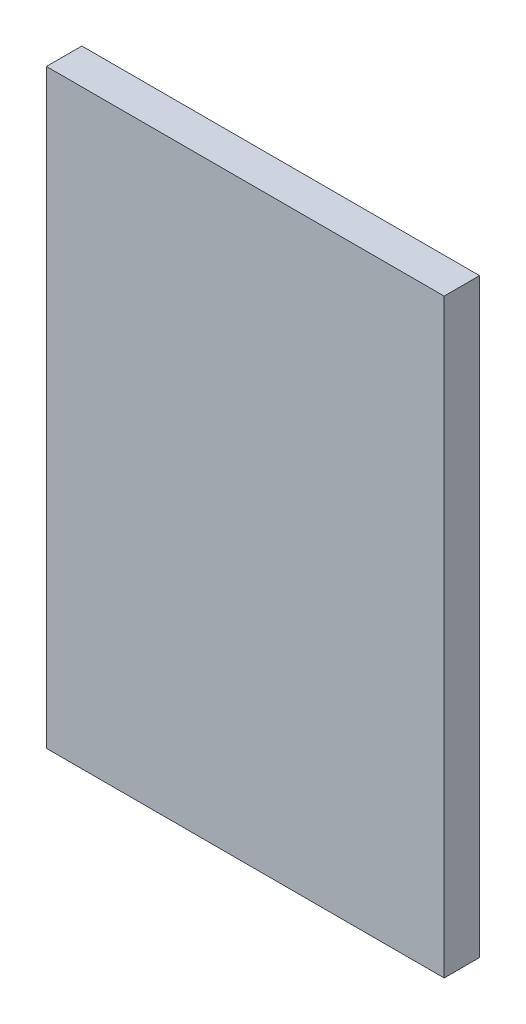
ISO-10303-21;
HEADER;
FILE_DESCRIPTION(('STEP AP214'),'2;1');
FILE_NAME('part.step','',(''),(''),'','','');
FILE_SCHEMA(('AUTOMOTIVE_DESIGN { 1 0 10303 214 1 1 1 1 }'));
ENDSEC;
DATA;
#1=APPLICATION_CONTEXT('core data for automotive mechanical design processes');
#2=APPLICATION_PROTOCOL_DEFINITION('international standard','automotive_design',2000,#1);
#3=PRODUCT_CONTEXT('',#1,'mechanical');
#4=PRODUCT('Part','Part','',(#3));
#5=PRODUCT_RELATED_PRODUCT_CATEGORY('part','',(#4));
#6=PRODUCT_DEFINITION_FORMATION('','',#4);
#7=PRODUCT_DEFINITION_CONTEXT('part definition',#1,'design');
#8=PRODUCT_DEFINITION('design','',#6,#7);
#9=PRODUCT_DEFINITION_SHAPE('','',#8);
#10=(LENGTH_UNIT() NAMED_UNIT(*) SI_UNIT(.MILLI.,.METRE.));
#11=(NAMED_UNIT(*) PLANE_ANGLE_UNIT() SI_UNIT($,.RADIAN.));
#12=(NAMED_UNIT(*) SI_UNIT($,.STERADIAN.) SOLID_ANGLE_UNIT());
#13=UNCERTAINTY_MEASURE_WITH_UNIT(LENGTH_MEASURE(1.E-05),#10,'distance_accuracy_value','');
#14=(GEOMETRIC_REPRESENTATION_CONTEXT(3) GLOBAL_UNCERTAINTY_ASSIGNED_CONTEXT((#13)) GLOBAL_UNIT_ASSIGNED_CONTEXT((#10,
#11,#12)) REPRESENTATION_CONTEXT('',''));
#15=CARTESIAN_POINT('',(0.,0.,0.));
#16=DIRECTION('',(0.,0.,1.));
#17=DIRECTION('',(1.,0.,0.));
#18=AXIS2_PLACEMENT_3D('',#15,#16,#17);
#19=CARTESIAN_POINT('',(99.8219999999999,148.209,17.78));
#20=DIRECTION('',(-1.,0.,0.));
#21=DIRECTION('',(0.,-1.,0.));
#22=AXIS2_PLACEMENT_3D('',#19,#20,#21);
#23=PLANE('',#22);
#24=DIRECTION('',(0.,1.,0.));
#25=VECTOR('',#24,1.);
#26=CARTESIAN_POINT('',(99.8219999999999,148.209,0.));
#27=LINE('',#26,#25);
#28=CARTESIAN_POINT('',(99.822,-148.209,0.));
#29=VERTEX_POINT('',#28);
#30=CARTESIAN_POINT('',(99.8219999999999,148.209,0.));
#31=VERTEX_POINT('',#30);
#32=EDGE_CURVE('E100',#29,#31,#27,.T.);
#33=ORIENTED_EDGE('',*,*,#32,.T.);
#34=DIRECTION('',(0.,0.,-1.));
#35=VECTOR('',#34,1.);
#36=CARTESIAN_POINT('',(99.8219999999999,148.209,17.78));
#37=LINE('',#36,#35);
#38=CARTESIAN_POINT('',(99.8219999999999,148.209,17.78));
#39=VERTEX_POINT('',#38);
#40=EDGE_CURVE('E11',#39,#31,#37,.T.);
#41=ORIENTED_EDGE('',*,*,#40,.F.);
#42=DIRECTION('',(0.,1.,0.));
#43=VECTOR('',#42,1.);
#44=CARTESIAN_POINT('',(99.8219999999999,148.209,17.78));
#45=LINE('',#44,#43);
#46=CARTESIAN_POINT('',(99.822,-148.209,17.78));
#47=VERTEX_POINT('',#46);
#48=EDGE_CURVE('E88',#47,#39,#45,.T.);
#49=ORIENTED_EDGE('',*,*,#48,.F.);
#50=DIRECTION('',(0.,0.,-1.));
#51=VECTOR('',#50,1.);
#52=CARTESIAN_POINT('',(99.822,-148.209,17.78));
#53=LINE('',#52,#51);
#54=EDGE_CURVE('E96',#47,#29,#53,.T.);
#55=ORIENTED_EDGE('',*,*,#54,.T.);
#56=EDGE_LOOP('',(#33,#41,#49,#55));
#57=FACE_BOUND('',#56,.T.);
#58=ADVANCED_FACE('F37',(#57),#23,.F.);
#59=CARTESIAN_POINT('',(-99.822,148.209,17.78));
#60=DIRECTION('',(0.,-1.,0.));
#61=DIRECTION('',(0.,0.,-1.));
#62=AXIS2_PLACEMENT_3D('',#59,#60,#61);
#63=PLANE('',#62);
#64=DIRECTION('',(-1.,0.,0.));
#65=VECTOR('',#64,1.);
#66=CARTESIAN_POINT('',(-99.822,148.209,0.));
#67=LINE('',#66,#65);
#68=CARTESIAN_POINT('',(-99.822,148.209,0.));
#69=VERTEX_POINT('',#68);
#70=EDGE_CURVE('E92',#31,#69,#67,.T.);
#71=ORIENTED_EDGE('',*,*,#70,.T.);
#72=DIRECTION('',(0.,0.,-1.));
#73=VECTOR('',#72,1.);
#74=CARTESIAN_POINT('',(-99.822,148.209,17.78));
#75=LINE('',#74,#73);
#76=CARTESIAN_POINT('',(-99.822,148.209,17.78));
#77=VERTEX_POINT('',#76);
#78=EDGE_CURVE('E45',#77,#69,#75,.T.);
#79=ORIENTED_EDGE('',*,*,#78,.F.);
#80=DIRECTION('',(-1.,0.,0.));
#81=VECTOR('',#80,1.);
#82=CARTESIAN_POINT('',(-99.822,148.209,17.78));
#83=LINE('',#82,#81);
#84=EDGE_CURVE('E83',#39,#77,#83,.T.);
#85=ORIENTED_EDGE('',*,*,#84,.F.);
#86=ORIENTED_EDGE('',*,*,#40,.T.);
#87=EDGE_LOOP('',(#71,#79,#85,#86));
#88=FACE_BOUND('',#87,.T.);
#89=ADVANCED_FACE('F91',(#88),#63,.F.);
#90=CARTESIAN_POINT('',(-99.822,148.209,17.78));
#91=DIRECTION('',(1.,0.,0.));
#92=DIRECTION('',(0.,1.,0.));
#93=AXIS2_PLACEMENT_3D('',#90,#91,#92);
#94=PLANE('',#93);
#95=DIRECTION('',(0.,-1.,0.));
#96=VECTOR('',#95,1.);
#97=CARTESIAN_POINT('',(-99.822,148.209,0.));
#98=LINE('',#97,#96);
#99=CARTESIAN_POINT('',(-99.822,-148.209,0.));
#100=VERTEX_POINT('',#99);
#101=EDGE_CURVE('E70',#69,#100,#98,.T.);
#102=ORIENTED_EDGE('',*,*,#101,.T.);
#103=DIRECTION('',(0.,0.,-1.));
#104=VECTOR('',#103,1.);
#105=CARTESIAN_POINT('',(-99.822,-148.209,17.78));
#106=LINE('',#105,#104);
#107=CARTESIAN_POINT('',(-99.822,-148.209,17.78));
#108=VERTEX_POINT('',#107);
#109=EDGE_CURVE('E93',#108,#100,#106,.T.);
#110=ORIENTED_EDGE('',*,*,#109,.F.);
#111=DIRECTION('',(0.,-1.,0.));
#112=VECTOR('',#111,1.);
#113=CARTESIAN_POINT('',(-99.822,148.209,17.78));
#114=LINE('',#113,#112);
#115=EDGE_CURVE('E86',#77,#108,#114,.T.);
#116=ORIENTED_EDGE('',*,*,#115,.F.);
#117=ORIENTED_EDGE('',*,*,#78,.T.);
#118=EDGE_LOOP('',(#102,#110,#116,#117));
#119=FACE_BOUND('',#118,.T.);
#120=ADVANCED_FACE('F94',(#119),#94,.F.);
#121=CARTESIAN_POINT('',(-99.822,-148.209,17.78));
#122=DIRECTION('',(0.,1.,0.));
#123=DIRECTION('',(0.,0.,1.));
#124=AXIS2_PLACEMENT_3D('',#121,#122,#123);
#125=PLANE('',#124);
#126=DIRECTION('',(1.,0.,0.));
#127=VECTOR('',#126,1.);
#128=CARTESIAN_POINT('',(-99.822,-148.209,0.));
#129=LINE('',#128,#127);
#130=EDGE_CURVE('E76',#100,#29,#129,.T.);
#131=ORIENTED_EDGE('',*,*,#130,.T.);
#132=ORIENTED_EDGE('',*,*,#54,.F.);
#133=DIRECTION('',(1.,0.,0.));
#134=VECTOR('',#133,1.);
#135=CARTESIAN_POINT('',(-99.822,-148.209,17.78));
#136=LINE('',#135,#134);
#137=EDGE_CURVE('E53',#108,#47,#136,.T.);
#138=ORIENTED_EDGE('',*,*,#137,.F.);
#139=ORIENTED_EDGE('',*,*,#109,.T.);
#140=EDGE_LOOP('',(#131,#132,#138,#139));
#141=FACE_BOUND('',#140,.T.);
#142=ADVANCED_FACE('F107',(#141),#125,.F.);
#143=CARTESIAN_POINT('',(0.,0.,17.78));
#144=DIRECTION('',(0.,0.,1.));
#145=DIRECTION('',(1.,0.,0.));
#146=AXIS2_PLACEMENT_3D('',#143,#144,#145);
#147=PLANE('',#146);
#148=ORIENTED_EDGE('',*,*,#48,.T.);
#149=ORIENTED_EDGE('',*,*,#84,.T.);
#150=ORIENTED_EDGE('',*,*,#115,.T.);
#151=ORIENTED_EDGE('',*,*,#137,.T.);
#152=EDGE_LOOP('',(#148,#149,#150,#151));
#153=FACE_BOUND('',#152,.T.);
#154=ADVANCED_FACE('F84',(#153),#147,.T.);
#155=CARTESIAN_POINT('',(0.,0.,0.));
#156=DIRECTION('',(0.,0.,1.));
#157=DIRECTION('',(1.,0.,0.));
#158=AXIS2_PLACEMENT_3D('',#155,#156,#157);
#159=PLANE('',#158);
#160=ORIENTED_EDGE('',*,*,#32,.F.);
#161=ORIENTED_EDGE('',*,*,#130,.F.);
#162=ORIENTED_EDGE('',*,*,#101,.F.);
#163=ORIENTED_EDGE('',*,*,#70,.F.);
#164=EDGE_LOOP('',(#160,#161,#162,#163));
#165=FACE_BOUND('',#164,.T.);
#166=ADVANCED_FACE('F110',(#165),#159,.F.);
#167=CLOSED_SHELL('',(#58,#89,#120,#142,#154,#166));
#168=MANIFOLD_SOLID_BREP('B2',#167);
#169=ADVANCED_BREP_SHAPE_REPRESENTATION('',(#18,#168),#14);
#170=SHAPE_DEFINITION_REPRESENTATION(#9,#169);
ENDSEC;
END-ISO-10303-21;
